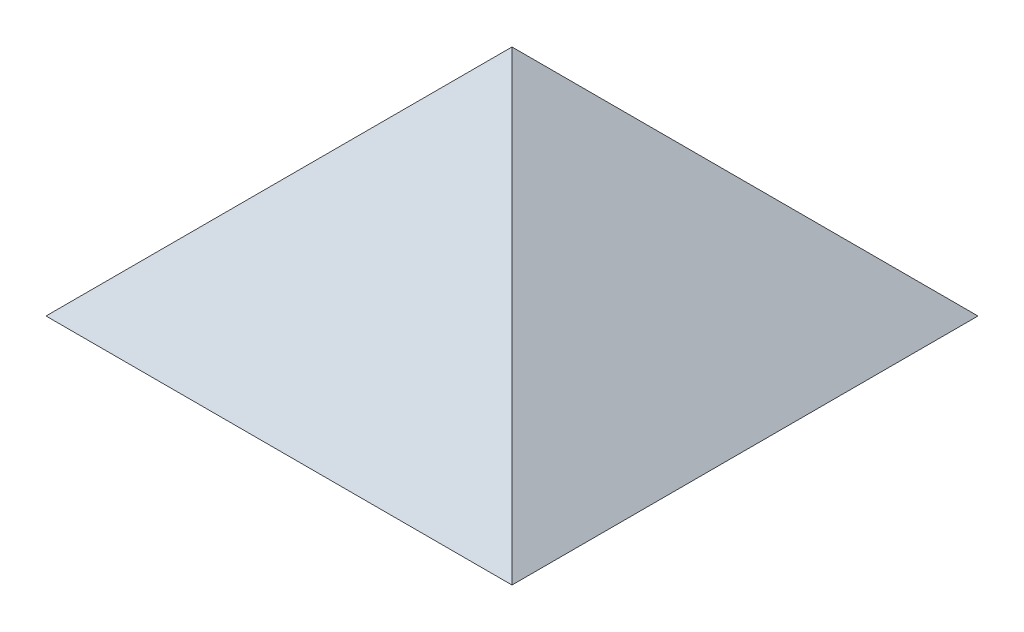
ISO-10303-21;
HEADER;
FILE_DESCRIPTION(('STEP AP214'),'2;1');
FILE_NAME('part.step','',(''),(''),'','','');
FILE_SCHEMA(('AUTOMOTIVE_DESIGN { 1 0 10303 214 1 1 1 1 }'));
ENDSEC;
DATA;
#1=APPLICATION_CONTEXT('core data for automotive mechanical design processes');
#2=APPLICATION_PROTOCOL_DEFINITION('international standard','automotive_design',2000,#1);
#3=PRODUCT_CONTEXT('',#1,'mechanical');
#4=PRODUCT('Part','Part','',(#3));
#5=PRODUCT_RELATED_PRODUCT_CATEGORY('part','',(#4));
#6=PRODUCT_DEFINITION_FORMATION('','',#4);
#7=PRODUCT_DEFINITION_CONTEXT('part definition',#1,'design');
#8=PRODUCT_DEFINITION('design','',#6,#7);
#9=PRODUCT_DEFINITION_SHAPE('','',#8);
#10=(LENGTH_UNIT() NAMED_UNIT(*) SI_UNIT(.MILLI.,.METRE.));
#11=(NAMED_UNIT(*) PLANE_ANGLE_UNIT() SI_UNIT($,.RADIAN.));
#12=(NAMED_UNIT(*) SI_UNIT($,.STERADIAN.) SOLID_ANGLE_UNIT());
#13=UNCERTAINTY_MEASURE_WITH_UNIT(LENGTH_MEASURE(1.E-05),#10,'distance_accuracy_value','');
#14=(GEOMETRIC_REPRESENTATION_CONTEXT(3) GLOBAL_UNCERTAINTY_ASSIGNED_CONTEXT((#13)) GLOBAL_UNIT_ASSIGNED_CONTEXT((#10,
#11,#12)) REPRESENTATION_CONTEXT('',''));
#15=CARTESIAN_POINT('',(0.,0.,0.));
#16=DIRECTION('',(0.,0.,1.));
#17=DIRECTION('',(1.,0.,0.));
#18=AXIS2_PLACEMENT_3D('',#15,#16,#17);
#19=CARTESIAN_POINT('',(50.,0.,50.));
#20=DIRECTION('',(0.707106781186546,0.707106781186549,0.));
#21=DIRECTION('',(-0.707106781186549,0.707106781186546,0.));
#22=AXIS2_PLACEMENT_3D('',#19,#20,#21);
#23=PLANE('',#22);
#24=DIRECTION('',(0.,0.,-1.));
#25=VECTOR('',#24,1.);
#26=CARTESIAN_POINT('',(50.,0.,50.));
#27=LINE('',#26,#25);
#28=CARTESIAN_POINT('',(50.,0.,50.));
#29=VERTEX_POINT('',#28);
#30=CARTESIAN_POINT('',(50.,0.,-50.));
#31=VERTEX_POINT('',#30);
#32=EDGE_CURVE('E72',#29,#31,#27,.T.);
#33=ORIENTED_EDGE('',*,*,#32,.T.);
#34=DIRECTION('',(0.577350269189627,-0.577350269189624,-0.577350269189627));
#35=VECTOR('',#34,1.);
#36=CARTESIAN_POINT('',(16.6666666666666,33.3333333333333,-16.6666666666666));
#37=LINE('',#36,#35);
#38=CARTESIAN_POINT('',(0.,49.9999999999998,0.));
#39=VERTEX_POINT('',#38);
#40=EDGE_CURVE('E11',#39,#31,#37,.T.);
#41=ORIENTED_EDGE('',*,*,#40,.F.);
#42=DIRECTION('',(0.577350269189627,-0.577350269189624,0.577350269189627));
#43=VECTOR('',#42,1.);
#44=CARTESIAN_POINT('',(50.,0.,50.));
#45=LINE('',#44,#43);
#46=EDGE_CURVE('E57',#39,#29,#45,.T.);
#47=ORIENTED_EDGE('',*,*,#46,.T.);
#48=EDGE_LOOP('',(#33,#41,#47));
#49=FACE_BOUND('',#48,.T.);
#50=ADVANCED_FACE('F35',(#49),#23,.T.);
#51=CARTESIAN_POINT('',(-50.,0.,-50.));
#52=DIRECTION('',(0.,0.707106781186549,-0.707106781186546));
#53=DIRECTION('',(0.,0.707106781186546,0.707106781186549));
#54=AXIS2_PLACEMENT_3D('',#51,#52,#53);
#55=PLANE('',#54);
#56=DIRECTION('',(-1.,0.,0.));
#57=VECTOR('',#56,1.);
#58=CARTESIAN_POINT('',(-50.,0.,-50.));
#59=LINE('',#58,#57);
#60=CARTESIAN_POINT('',(-50.,0.,-50.));
#61=VERTEX_POINT('',#60);
#62=EDGE_CURVE('E69',#31,#61,#59,.T.);
#63=ORIENTED_EDGE('',*,*,#62,.T.);
#64=DIRECTION('',(-0.577350269189627,-0.577350269189624,-0.577350269189627));
#65=VECTOR('',#64,1.);
#66=CARTESIAN_POINT('',(-16.6666666666666,33.3333333333333,-16.6666666666666));
#67=LINE('',#66,#65);
#68=EDGE_CURVE('E39',#39,#61,#67,.T.);
#69=ORIENTED_EDGE('',*,*,#68,.F.);
#70=ORIENTED_EDGE('',*,*,#40,.T.);
#71=EDGE_LOOP('',(#63,#69,#70));
#72=FACE_BOUND('',#71,.T.);
#73=ADVANCED_FACE('F37',(#72),#55,.T.);
#74=CARTESIAN_POINT('',(-50.,0.,50.));
#75=DIRECTION('',(-0.707106781186546,0.707106781186549,0.));
#76=DIRECTION('',(-0.707106781186549,-0.707106781186546,0.));
#77=AXIS2_PLACEMENT_3D('',#74,#75,#76);
#78=PLANE('',#77);
#79=DIRECTION('',(0.,0.,1.));
#80=VECTOR('',#79,1.);
#81=CARTESIAN_POINT('',(-50.,0.,50.));
#82=LINE('',#81,#80);
#83=CARTESIAN_POINT('',(-50.,0.,50.));
#84=VERTEX_POINT('',#83);
#85=EDGE_CURVE('E74',#61,#84,#82,.T.);
#86=ORIENTED_EDGE('',*,*,#85,.T.);
#87=DIRECTION('',(-0.577350269189627,-0.577350269189624,0.577350269189627));
#88=VECTOR('',#87,1.);
#89=CARTESIAN_POINT('',(-50.,0.,50.));
#90=LINE('',#89,#88);
#91=EDGE_CURVE('E81',#39,#84,#90,.T.);
#92=ORIENTED_EDGE('',*,*,#91,.F.);
#93=ORIENTED_EDGE('',*,*,#68,.T.);
#94=EDGE_LOOP('',(#86,#92,#93));
#95=FACE_BOUND('',#94,.T.);
#96=ADVANCED_FACE('F84',(#95),#78,.T.);
#97=CARTESIAN_POINT('',(-50.,0.,50.));
#98=DIRECTION('',(0.,0.707106781186549,0.707106781186546));
#99=DIRECTION('',(0.,-0.707106781186546,0.707106781186549));
#100=AXIS2_PLACEMENT_3D('',#97,#98,#99);
#101=PLANE('',#100);
#102=DIRECTION('',(1.,0.,0.));
#103=VECTOR('',#102,1.);
#104=CARTESIAN_POINT('',(-50.,0.,50.));
#105=LINE('',#104,#103);
#106=EDGE_CURVE('E79',#84,#29,#105,.T.);
#107=ORIENTED_EDGE('',*,*,#106,.T.);
#108=ORIENTED_EDGE('',*,*,#46,.F.);
#109=ORIENTED_EDGE('',*,*,#91,.T.);
#110=EDGE_LOOP('',(#107,#108,#109));
#111=FACE_BOUND('',#110,.T.);
#112=ADVANCED_FACE('F85',(#111),#101,.T.);
#113=CARTESIAN_POINT('',(0.,0.,0.));
#114=DIRECTION('',(0.,-1.,0.));
#115=DIRECTION('',(0.,0.,-1.));
#116=AXIS2_PLACEMENT_3D('',#113,#114,#115);
#117=PLANE('',#116);
#118=ORIENTED_EDGE('',*,*,#32,.F.);
#119=ORIENTED_EDGE('',*,*,#106,.F.);
#120=ORIENTED_EDGE('',*,*,#85,.F.);
#121=ORIENTED_EDGE('',*,*,#62,.F.);
#122=EDGE_LOOP('',(#118,#119,#120,#121));
#123=FACE_BOUND('',#122,.T.);
#124=ADVANCED_FACE('F70',(#123),#117,.T.);
#125=CLOSED_SHELL('',(#50,#73,#96,#112,#124));
#126=MANIFOLD_SOLID_BREP('B2',#125);
#127=ADVANCED_BREP_SHAPE_REPRESENTATION('',(#18,#126),#14);
#128=SHAPE_DEFINITION_REPRESENTATION(#9,#127);
ENDSEC;
END-ISO-10303-21;
